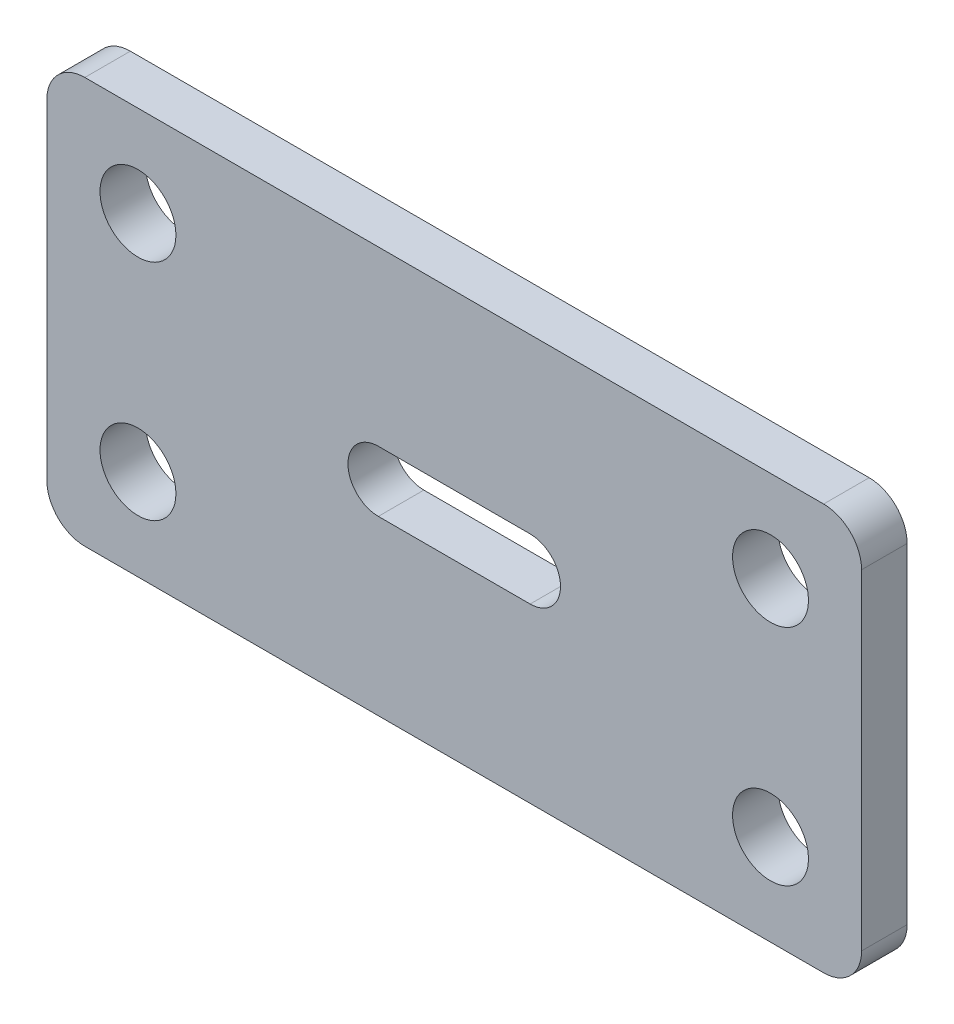
ISO-10303-21;
HEADER;
FILE_DESCRIPTION(('STEP AP214'),'2;1');
FILE_NAME('part.step','',(''),(''),'','','');
FILE_SCHEMA(('AUTOMOTIVE_DESIGN { 1 0 10303 214 1 1 1 1 }'));
ENDSEC;
DATA;
#1=APPLICATION_CONTEXT('core data for automotive mechanical design processes');
#2=APPLICATION_PROTOCOL_DEFINITION('international standard','automotive_design',2000,#1);
#3=PRODUCT_CONTEXT('',#1,'mechanical');
#4=PRODUCT('Part','Part','',(#3));
#5=PRODUCT_RELATED_PRODUCT_CATEGORY('part','',(#4));
#6=PRODUCT_DEFINITION_FORMATION('','',#4);
#7=PRODUCT_DEFINITION_CONTEXT('part definition',#1,'design');
#8=PRODUCT_DEFINITION('design','',#6,#7);
#9=PRODUCT_DEFINITION_SHAPE('','',#8);
#10=(LENGTH_UNIT() NAMED_UNIT(*) SI_UNIT(.MILLI.,.METRE.));
#11=(NAMED_UNIT(*) PLANE_ANGLE_UNIT() SI_UNIT($,.RADIAN.));
#12=(NAMED_UNIT(*) SI_UNIT($,.STERADIAN.) SOLID_ANGLE_UNIT());
#13=UNCERTAINTY_MEASURE_WITH_UNIT(LENGTH_MEASURE(1.E-05),#10,'distance_accuracy_value','');
#14=(GEOMETRIC_REPRESENTATION_CONTEXT(3) GLOBAL_UNCERTAINTY_ASSIGNED_CONTEXT((#13)) GLOBAL_UNIT_ASSIGNED_CONTEXT((#10,
#11,#12)) REPRESENTATION_CONTEXT('',''));
#15=CARTESIAN_POINT('',(0.,0.,0.));
#16=DIRECTION('',(0.,0.,1.));
#17=DIRECTION('',(1.,0.,0.));
#18=AXIS2_PLACEMENT_3D('',#15,#16,#17);
#19=CARTESIAN_POINT('',(48.6689135783933,-141.130234818841,-582.548439615241));
#20=DIRECTION('',(0.,0.,1.));
#21=DIRECTION('',(1.,0.,0.));
#22=AXIS2_PLACEMENT_3D('',#19,#20,#21);
#23=PLANE('',#22);
#24=DIRECTION('',(1.,0.,0.));
#25=VECTOR('',#24,1.);
#26=CARTESIAN_POINT('',(0.,-115.384107551489,-582.548439615241));
#27=LINE('',#26,#25);
#28=CARTESIAN_POINT('',(-10.,-115.384107551489,-582.548439615241));
#29=VERTEX_POINT('',#28);
#30=CARTESIAN_POINT('',(10.,-115.384107551489,-582.548439615241));
#31=VERTEX_POINT('',#30);
#32=EDGE_CURVE('E160',#29,#31,#27,.T.);
#33=ORIENTED_EDGE('',*,*,#32,.F.);
#34=CARTESIAN_POINT('',(-10.,-119.384107551489,-582.548439615241));
#35=DIRECTION('',(0.,0.,1.));
#36=DIRECTION('',(1.,0.,0.));
#37=AXIS2_PLACEMENT_3D('',#34,#35,#36);
#38=CIRCLE('',#37,4.);
#39=CARTESIAN_POINT('',(-10.,-123.384107551489,-582.548439615241));
#40=VERTEX_POINT('',#39);
#41=EDGE_CURVE('E153',#29,#40,#38,.T.);
#42=ORIENTED_EDGE('',*,*,#41,.T.);
#43=DIRECTION('',(1.,0.,0.));
#44=VECTOR('',#43,1.);
#45=CARTESIAN_POINT('',(0.,-123.384107551489,-582.548439615241));
#46=LINE('',#45,#44);
#47=CARTESIAN_POINT('',(10.,-123.384107551489,-582.548439615241));
#48=VERTEX_POINT('',#47);
#49=EDGE_CURVE('E136',#40,#48,#46,.T.);
#50=ORIENTED_EDGE('',*,*,#49,.T.);
#51=CARTESIAN_POINT('',(10.,-119.384107551489,-582.548439615241));
#52=DIRECTION('',(0.,0.,-1.));
#53=DIRECTION('',(-1.,0.,0.));
#54=AXIS2_PLACEMENT_3D('',#51,#52,#53);
#55=CIRCLE('',#54,4.);
#56=EDGE_CURVE('E231',#31,#48,#55,.T.);
#57=ORIENTED_EDGE('',*,*,#56,.F.);
#58=EDGE_LOOP('',(#33,#42,#50,#57));
#59=FACE_BOUND('',#58,.T.);
#60=CARTESIAN_POINT('',(41.6689135783934,-134.130234818843,-582.548439615241));
#61=DIRECTION('',(0.,0.,-1.));
#62=DIRECTION('',(-1.,0.,0.));
#63=AXIS2_PLACEMENT_3D('',#60,#61,#62);
#64=CIRCLE('',#63,5.00000000000078);
#65=CARTESIAN_POINT('',(36.6689135783926,-134.130234818843,-582.548439615241));
#66=VERTEX_POINT('',#65);
#67=EDGE_CURVE('E235',#66,#66,#64,.T.);
#68=ORIENTED_EDGE('',*,*,#67,.F.);
#69=EDGE_LOOP('',(#68));
#70=FACE_BOUND('',#69,.T.);
#71=CARTESIAN_POINT('',(41.6689135783934,-104.637980284137,-582.548439615241));
#72=DIRECTION('',(0.,0.,-1.));
#73=DIRECTION('',(-1.,0.,0.));
#74=AXIS2_PLACEMENT_3D('',#71,#72,#73);
#75=CIRCLE('',#74,5.);
#76=CARTESIAN_POINT('',(36.6689135783934,-104.637980284137,-582.548439615241));
#77=VERTEX_POINT('',#76);
#78=EDGE_CURVE('E243',#77,#77,#75,.T.);
#79=ORIENTED_EDGE('',*,*,#78,.F.);
#80=EDGE_LOOP('',(#79));
#81=FACE_BOUND('',#80,.T.);
#82=CARTESIAN_POINT('',(-48.6689135783934,-97.6379802841375,-582.548439615241));
#83=DIRECTION('',(0.,0.,1.));
#84=DIRECTION('',(1.,0.,0.));
#85=AXIS2_PLACEMENT_3D('',#82,#83,#84);
#86=CIRCLE('',#85,5.);
#87=CARTESIAN_POINT('',(-48.6689135783933,-92.6379802841375,-582.548439615241));
#88=VERTEX_POINT('',#87);
#89=CARTESIAN_POINT('',(-53.6689135783934,-97.6379802841375,-582.548439615241));
#90=VERTEX_POINT('',#89);
#91=EDGE_CURVE('E190',#88,#90,#86,.T.);
#92=ORIENTED_EDGE('',*,*,#91,.F.);
#93=DIRECTION('',(1.,0.,0.));
#94=VECTOR('',#93,1.);
#95=CARTESIAN_POINT('',(48.6689135783933,-92.6379802841375,-582.548439615241));
#96=LINE('',#95,#94);
#97=CARTESIAN_POINT('',(48.6689135783933,-92.6379802841375,-582.548439615241));
#98=VERTEX_POINT('',#97);
#99=EDGE_CURVE('E255',#88,#98,#96,.T.);
#100=ORIENTED_EDGE('',*,*,#99,.T.);
#101=CARTESIAN_POINT('',(48.6689135783934,-97.6379802841375,-582.548439615241));
#102=DIRECTION('',(0.,0.,-1.));
#103=DIRECTION('',(-1.,0.,0.));
#104=AXIS2_PLACEMENT_3D('',#101,#102,#103);
#105=CIRCLE('',#104,5.);
#106=CARTESIAN_POINT('',(53.6689135783934,-97.6379802841375,-582.548439615241));
#107=VERTEX_POINT('',#106);
#108=EDGE_CURVE('E258',#98,#107,#105,.T.);
#109=ORIENTED_EDGE('',*,*,#108,.T.);
#110=DIRECTION('',(0.,-1.,0.));
#111=VECTOR('',#110,1.);
#112=CARTESIAN_POINT('',(53.6689135783934,-97.6379802841375,-582.548439615241));
#113=LINE('',#112,#111);
#114=CARTESIAN_POINT('',(53.6689135783933,-141.130234818841,-582.548439615241));
#115=VERTEX_POINT('',#114);
#116=EDGE_CURVE('E60',#107,#115,#113,.T.);
#117=ORIENTED_EDGE('',*,*,#116,.T.);
#118=CARTESIAN_POINT('',(48.6689135783933,-141.130234818841,-582.548439615241));
#119=DIRECTION('',(0.,0.,-1.));
#120=DIRECTION('',(1.,0.,0.));
#121=AXIS2_PLACEMENT_3D('',#118,#119,#120);
#122=CIRCLE('',#121,5.);
#123=CARTESIAN_POINT('',(48.6689135783933,-146.130234818841,-582.548439615241));
#124=VERTEX_POINT('',#123);
#125=EDGE_CURVE('E250',#115,#124,#122,.T.);
#126=ORIENTED_EDGE('',*,*,#125,.T.);
#127=DIRECTION('',(-1.,0.,0.));
#128=VECTOR('',#127,1.);
#129=CARTESIAN_POINT('',(48.6689135783933,-146.130234818841,-582.548439615241));
#130=LINE('',#129,#128);
#131=CARTESIAN_POINT('',(-48.6689135783933,-146.130234818841,-582.548439615241));
#132=VERTEX_POINT('',#131);
#133=EDGE_CURVE('E89',#124,#132,#130,.T.);
#134=ORIENTED_EDGE('',*,*,#133,.T.);
#135=CARTESIAN_POINT('',(-48.6689135783933,-141.130234818841,-582.548439615241));
#136=DIRECTION('',(0.,0.,1.));
#137=DIRECTION('',(-1.,0.,0.));
#138=AXIS2_PLACEMENT_3D('',#135,#136,#137);
#139=CIRCLE('',#138,5.);
#140=CARTESIAN_POINT('',(-53.6689135783933,-141.130234818841,-582.548439615241));
#141=VERTEX_POINT('',#140);
#142=EDGE_CURVE('E186',#141,#132,#139,.T.);
#143=ORIENTED_EDGE('',*,*,#142,.F.);
#144=DIRECTION('',(0.,-1.,0.));
#145=VECTOR('',#144,1.);
#146=CARTESIAN_POINT('',(-53.6689135783934,-97.6379802841375,-582.548439615241));
#147=LINE('',#146,#145);
#148=EDGE_CURVE('E195',#90,#141,#147,.T.);
#149=ORIENTED_EDGE('',*,*,#148,.F.);
#150=EDGE_LOOP('',(#92,#100,#109,#117,#126,#134,#143,#149));
#151=FACE_BOUND('',#150,.T.);
#152=CARTESIAN_POINT('',(-41.6689135783934,-134.130234818843,-582.548439615241));
#153=DIRECTION('',(0.,0.,1.));
#154=DIRECTION('',(1.,0.,0.));
#155=AXIS2_PLACEMENT_3D('',#152,#153,#154);
#156=CIRCLE('',#155,5.00000000000078);
#157=CARTESIAN_POINT('',(-36.6689135783926,-134.130234818843,-582.548439615241));
#158=VERTEX_POINT('',#157);
#159=EDGE_CURVE('E170',#158,#158,#156,.T.);
#160=ORIENTED_EDGE('',*,*,#159,.T.);
#161=EDGE_LOOP('',(#160));
#162=FACE_BOUND('',#161,.T.);
#163=CARTESIAN_POINT('',(-41.6689135783934,-104.637980284137,-582.548439615241));
#164=DIRECTION('',(0.,0.,1.));
#165=DIRECTION('',(1.,0.,0.));
#166=AXIS2_PLACEMENT_3D('',#163,#164,#165);
#167=CIRCLE('',#166,5.);
#168=CARTESIAN_POINT('',(-36.6689135783934,-104.637980284137,-582.548439615241));
#169=VERTEX_POINT('',#168);
#170=EDGE_CURVE('E178',#169,#169,#167,.T.);
#171=ORIENTED_EDGE('',*,*,#170,.T.);
#172=EDGE_LOOP('',(#171));
#173=FACE_BOUND('',#172,.T.);
#174=ADVANCED_FACE('F36',(#59,#70,#81,#151,#162,#173),#23,.F.);
#175=CARTESIAN_POINT('',(48.6689135783933,-141.130234818841,-576.548439615241));
#176=DIRECTION('',(0.,0.,1.));
#177=DIRECTION('',(1.,0.,0.));
#178=AXIS2_PLACEMENT_3D('',#175,#176,#177);
#179=PLANE('',#178);
#180=DIRECTION('',(1.,0.,0.));
#181=VECTOR('',#180,1.);
#182=CARTESIAN_POINT('',(48.6689135783933,-92.6379802841375,-576.548439615241));
#183=LINE('',#182,#181);
#184=CARTESIAN_POINT('',(-48.6689135783933,-92.6379802841375,-576.548439615241));
#185=VERTEX_POINT('',#184);
#186=CARTESIAN_POINT('',(48.6689135783933,-92.6379802841375,-576.548439615241));
#187=VERTEX_POINT('',#186);
#188=EDGE_CURVE('E270',#185,#187,#183,.T.);
#189=ORIENTED_EDGE('',*,*,#188,.F.);
#190=CARTESIAN_POINT('',(-48.6689135783934,-97.6379802841375,-576.548439615241));
#191=DIRECTION('',(0.,0.,1.));
#192=DIRECTION('',(1.,0.,0.));
#193=AXIS2_PLACEMENT_3D('',#190,#191,#192);
#194=CIRCLE('',#193,5.);
#195=CARTESIAN_POINT('',(-53.6689135783934,-97.6379802841375,-576.548439615241));
#196=VERTEX_POINT('',#195);
#197=EDGE_CURVE('E203',#185,#196,#194,.T.);
#198=ORIENTED_EDGE('',*,*,#197,.T.);
#199=DIRECTION('',(0.,-1.,0.));
#200=VECTOR('',#199,1.);
#201=CARTESIAN_POINT('',(-53.6689135783934,-97.6379802841375,-576.548439615241));
#202=LINE('',#201,#200);
#203=CARTESIAN_POINT('',(-53.6689135783933,-141.130234818841,-576.548439615241));
#204=VERTEX_POINT('',#203);
#205=EDGE_CURVE('E191',#196,#204,#202,.T.);
#206=ORIENTED_EDGE('',*,*,#205,.T.);
#207=CARTESIAN_POINT('',(-48.6689135783933,-141.130234818841,-576.548439615241));
#208=DIRECTION('',(0.,0.,1.));
#209=DIRECTION('',(-1.,0.,0.));
#210=AXIS2_PLACEMENT_3D('',#207,#208,#209);
#211=CIRCLE('',#210,5.);
#212=CARTESIAN_POINT('',(-48.6689135783933,-146.130234818841,-576.548439615241));
#213=VERTEX_POINT('',#212);
#214=EDGE_CURVE('E182',#204,#213,#211,.T.);
#215=ORIENTED_EDGE('',*,*,#214,.T.);
#216=DIRECTION('',(-1.,0.,0.));
#217=VECTOR('',#216,1.);
#218=CARTESIAN_POINT('',(48.6689135783933,-146.130234818841,-576.548439615241));
#219=LINE('',#218,#217);
#220=CARTESIAN_POINT('',(48.6689135783933,-146.130234818841,-576.548439615241));
#221=VERTEX_POINT('',#220);
#222=EDGE_CURVE('E267',#221,#213,#219,.T.);
#223=ORIENTED_EDGE('',*,*,#222,.F.);
#224=CARTESIAN_POINT('',(48.6689135783933,-141.130234818841,-576.548439615241));
#225=DIRECTION('',(0.,0.,-1.));
#226=DIRECTION('',(1.,0.,0.));
#227=AXIS2_PLACEMENT_3D('',#224,#225,#226);
#228=CIRCLE('',#227,5.);
#229=CARTESIAN_POINT('',(53.6689135783933,-141.130234818841,-576.548439615241));
#230=VERTEX_POINT('',#229);
#231=EDGE_CURVE('E247',#230,#221,#228,.T.);
#232=ORIENTED_EDGE('',*,*,#231,.F.);
#233=DIRECTION('',(0.,-1.,0.));
#234=VECTOR('',#233,1.);
#235=CARTESIAN_POINT('',(53.6689135783934,-97.6379802841375,-576.548439615241));
#236=LINE('',#235,#234);
#237=CARTESIAN_POINT('',(53.6689135783934,-97.6379802841375,-576.548439615241));
#238=VERTEX_POINT('',#237);
#239=EDGE_CURVE('E81',#238,#230,#236,.T.);
#240=ORIENTED_EDGE('',*,*,#239,.F.);
#241=CARTESIAN_POINT('',(48.6689135783934,-97.6379802841375,-576.548439615241));
#242=DIRECTION('',(0.,0.,-1.));
#243=DIRECTION('',(-1.,0.,0.));
#244=AXIS2_PLACEMENT_3D('',#241,#242,#243);
#245=CIRCLE('',#244,5.);
#246=EDGE_CURVE('E273',#187,#238,#245,.T.);
#247=ORIENTED_EDGE('',*,*,#246,.F.);
#248=EDGE_LOOP('',(#189,#198,#206,#215,#223,#232,#240,#247));
#249=FACE_BOUND('',#248,.T.);
#250=CARTESIAN_POINT('',(41.6689135783934,-134.130234818843,-576.548439615241));
#251=DIRECTION('',(0.,0.,-1.));
#252=DIRECTION('',(-1.,0.,0.));
#253=AXIS2_PLACEMENT_3D('',#250,#251,#252);
#254=CIRCLE('',#253,5.00000000000078);
#255=CARTESIAN_POINT('',(36.6689135783926,-134.130234818843,-576.548439615241));
#256=VERTEX_POINT('',#255);
#257=EDGE_CURVE('E239',#256,#256,#254,.T.);
#258=ORIENTED_EDGE('',*,*,#257,.T.);
#259=EDGE_LOOP('',(#258));
#260=FACE_BOUND('',#259,.T.);
#261=CARTESIAN_POINT('',(41.6689135783934,-104.637980284137,-576.548439615241));
#262=DIRECTION('',(0.,0.,-1.));
#263=DIRECTION('',(-1.,0.,0.));
#264=AXIS2_PLACEMENT_3D('',#261,#262,#263);
#265=CIRCLE('',#264,5.);
#266=CARTESIAN_POINT('',(36.6689135783934,-104.637980284137,-576.548439615241));
#267=VERTEX_POINT('',#266);
#268=EDGE_CURVE('E238',#267,#267,#265,.T.);
#269=ORIENTED_EDGE('',*,*,#268,.T.);
#270=EDGE_LOOP('',(#269));
#271=FACE_BOUND('',#270,.T.);
#272=CARTESIAN_POINT('',(-10.,-119.384107551489,-576.548439615241));
#273=DIRECTION('',(0.,0.,-1.));
#274=DIRECTION('',(-1.,0.,0.));
#275=AXIS2_PLACEMENT_3D('',#272,#273,#274);
#276=CIRCLE('',#275,4.);
#277=CARTESIAN_POINT('',(-10.,-123.384107551489,-576.548439615241));
#278=VERTEX_POINT('',#277);
#279=CARTESIAN_POINT('',(-10.,-115.384107551489,-576.548439615241));
#280=VERTEX_POINT('',#279);
#281=EDGE_CURVE('E155',#278,#280,#276,.T.);
#282=ORIENTED_EDGE('',*,*,#281,.T.);
#283=DIRECTION('',(1.,0.,0.));
#284=VECTOR('',#283,1.);
#285=CARTESIAN_POINT('',(0.,-115.384107551489,-576.548439615241));
#286=LINE('',#285,#284);
#287=CARTESIAN_POINT('',(10.,-115.384107551489,-576.548439615241));
#288=VERTEX_POINT('',#287);
#289=EDGE_CURVE('E226',#280,#288,#286,.T.);
#290=ORIENTED_EDGE('',*,*,#289,.T.);
#291=CARTESIAN_POINT('',(10.,-119.384107551489,-576.548439615241));
#292=DIRECTION('',(0.,0.,1.));
#293=DIRECTION('',(1.,0.,0.));
#294=AXIS2_PLACEMENT_3D('',#291,#292,#293);
#295=CIRCLE('',#294,4.);
#296=CARTESIAN_POINT('',(10.,-123.384107551489,-576.548439615241));
#297=VERTEX_POINT('',#296);
#298=EDGE_CURVE('E234',#297,#288,#295,.T.);
#299=ORIENTED_EDGE('',*,*,#298,.F.);
#300=DIRECTION('',(1.,0.,0.));
#301=VECTOR('',#300,1.);
#302=CARTESIAN_POINT('',(0.,-123.384107551489,-576.548439615241));
#303=LINE('',#302,#301);
#304=EDGE_CURVE('E146',#278,#297,#303,.T.);
#305=ORIENTED_EDGE('',*,*,#304,.F.);
#306=EDGE_LOOP('',(#282,#290,#299,#305));
#307=FACE_BOUND('',#306,.T.);
#308=CARTESIAN_POINT('',(-41.6689135783934,-134.130234818843,-576.548439615241));
#309=DIRECTION('',(0.,0.,1.));
#310=DIRECTION('',(1.,0.,0.));
#311=AXIS2_PLACEMENT_3D('',#308,#309,#310);
#312=CIRCLE('',#311,5.00000000000078);
#313=CARTESIAN_POINT('',(-36.6689135783926,-134.130234818843,-576.548439615241));
#314=VERTEX_POINT('',#313);
#315=EDGE_CURVE('E167',#314,#314,#312,.T.);
#316=ORIENTED_EDGE('',*,*,#315,.F.);
#317=EDGE_LOOP('',(#316));
#318=FACE_BOUND('',#317,.T.);
#319=CARTESIAN_POINT('',(-41.6689135783934,-104.637980284137,-576.548439615241));
#320=DIRECTION('',(0.,0.,1.));
#321=DIRECTION('',(1.,0.,0.));
#322=AXIS2_PLACEMENT_3D('',#319,#320,#321);
#323=CIRCLE('',#322,5.);
#324=CARTESIAN_POINT('',(-36.6689135783934,-104.637980284137,-576.548439615241));
#325=VERTEX_POINT('',#324);
#326=EDGE_CURVE('E174',#325,#325,#323,.T.);
#327=ORIENTED_EDGE('',*,*,#326,.F.);
#328=EDGE_LOOP('',(#327));
#329=FACE_BOUND('',#328,.T.);
#330=ADVANCED_FACE('F295',(#249,#260,#271,#307,#318,#329),#179,.T.);
#331=CARTESIAN_POINT('',(48.6689135783933,-146.130234818841,-582.548439615241));
#332=DIRECTION('',(0.,1.,0.));
#333=DIRECTION('',(0.,0.,1.));
#334=AXIS2_PLACEMENT_3D('',#331,#332,#333);
#335=PLANE('',#334);
#336=ORIENTED_EDGE('',*,*,#222,.T.);
#337=DIRECTION('',(0.,0.,1.));
#338=VECTOR('',#337,1.);
#339=CARTESIAN_POINT('',(-48.6689135783933,-146.130234818841,-582.548439615241));
#340=LINE('',#339,#338);
#341=EDGE_CURVE('E157',#132,#213,#340,.T.);
#342=ORIENTED_EDGE('',*,*,#341,.F.);
#343=ORIENTED_EDGE('',*,*,#133,.F.);
#344=DIRECTION('',(0.,0.,1.));
#345=VECTOR('',#344,1.);
#346=CARTESIAN_POINT('',(48.6689135783933,-146.130234818841,-582.548439615241));
#347=LINE('',#346,#345);
#348=EDGE_CURVE('E287',#124,#221,#347,.T.);
#349=ORIENTED_EDGE('',*,*,#348,.T.);
#350=EDGE_LOOP('',(#336,#342,#343,#349));
#351=FACE_BOUND('',#350,.T.);
#352=ADVANCED_FACE('F314',(#351),#335,.F.);
#353=CARTESIAN_POINT('',(48.6689135783933,-92.6379802841375,-582.548439615241));
#354=DIRECTION('',(0.,-1.,0.));
#355=DIRECTION('',(0.,0.,-1.));
#356=AXIS2_PLACEMENT_3D('',#353,#354,#355);
#357=PLANE('',#356);
#358=ORIENTED_EDGE('',*,*,#99,.F.);
#359=DIRECTION('',(0.,0.,1.));
#360=VECTOR('',#359,1.);
#361=CARTESIAN_POINT('',(-48.6689135783933,-92.6379802841375,-582.548439615241));
#362=LINE('',#361,#360);
#363=EDGE_CURVE('E215',#88,#185,#362,.T.);
#364=ORIENTED_EDGE('',*,*,#363,.T.);
#365=ORIENTED_EDGE('',*,*,#188,.T.);
#366=DIRECTION('',(0.,0.,1.));
#367=VECTOR('',#366,1.);
#368=CARTESIAN_POINT('',(48.6689135783933,-92.6379802841375,-582.548439615241));
#369=LINE('',#368,#367);
#370=EDGE_CURVE('E283',#98,#187,#369,.T.);
#371=ORIENTED_EDGE('',*,*,#370,.F.);
#372=EDGE_LOOP('',(#358,#364,#365,#371));
#373=FACE_BOUND('',#372,.T.);
#374=ADVANCED_FACE('F326',(#373),#357,.F.);
#375=CARTESIAN_POINT('',(10.,-119.384107551489,-558.548439615241));
#376=DIRECTION('',(0.,0.,-1.));
#377=DIRECTION('',(-1.,0.,0.));
#378=AXIS2_PLACEMENT_3D('',#375,#376,#377);
#379=CYLINDRICAL_SURFACE('',#378,4.);
#380=DIRECTION('',(0.,0.,-1.));
#381=VECTOR('',#380,1.);
#382=CARTESIAN_POINT('',(10.,-115.384107551489,-558.548439615241));
#383=LINE('',#382,#381);
#384=EDGE_CURVE('E11',#31,#288,#383,.F.);
#385=ORIENTED_EDGE('',*,*,#384,.F.);
#386=ORIENTED_EDGE('',*,*,#56,.T.);
#387=DIRECTION('',(0.,0.,-1.));
#388=VECTOR('',#387,1.);
#389=CARTESIAN_POINT('',(10.,-123.384107551489,-558.548439615241));
#390=LINE('',#389,#388);
#391=EDGE_CURVE('E45',#297,#48,#390,.T.);
#392=ORIENTED_EDGE('',*,*,#391,.F.);
#393=ORIENTED_EDGE('',*,*,#298,.T.);
#394=EDGE_LOOP('',(#385,#386,#392,#393));
#395=FACE_BOUND('',#394,.T.);
#396=ADVANCED_FACE('F293',(#395),#379,.F.);
#397=CARTESIAN_POINT('',(48.6689135783933,-141.130234818841,-582.548439615241));
#398=DIRECTION('',(0.,0.,1.));
#399=DIRECTION('',(1.,0.,0.));
#400=AXIS2_PLACEMENT_3D('',#397,#398,#399);
#401=CYLINDRICAL_SURFACE('',#400,5.);
#402=ORIENTED_EDGE('',*,*,#231,.T.);
#403=ORIENTED_EDGE('',*,*,#348,.F.);
#404=ORIENTED_EDGE('',*,*,#125,.F.);
#405=DIRECTION('',(0.,0.,1.));
#406=VECTOR('',#405,1.);
#407=CARTESIAN_POINT('',(53.6689135783933,-141.130234818841,-582.548439615241));
#408=LINE('',#407,#406);
#409=EDGE_CURVE('E263',#115,#230,#408,.T.);
#410=ORIENTED_EDGE('',*,*,#409,.T.);
#411=EDGE_LOOP('',(#402,#403,#404,#410));
#412=FACE_BOUND('',#411,.T.);
#413=ADVANCED_FACE('F38',(#412),#401,.T.);
#414=CARTESIAN_POINT('',(48.6689135783934,-97.6379802841375,-582.548439615241));
#415=DIRECTION('',(0.,0.,1.));
#416=DIRECTION('',(1.,0.,0.));
#417=AXIS2_PLACEMENT_3D('',#414,#415,#416);
#418=CYLINDRICAL_SURFACE('',#417,5.);
#419=ORIENTED_EDGE('',*,*,#246,.T.);
#420=DIRECTION('',(0.,0.,1.));
#421=VECTOR('',#420,1.);
#422=CARTESIAN_POINT('',(53.6689135783934,-97.6379802841375,-582.548439615241));
#423=LINE('',#422,#421);
#424=EDGE_CURVE('E280',#107,#238,#423,.T.);
#425=ORIENTED_EDGE('',*,*,#424,.F.);
#426=ORIENTED_EDGE('',*,*,#108,.F.);
#427=ORIENTED_EDGE('',*,*,#370,.T.);
#428=EDGE_LOOP('',(#419,#425,#426,#427));
#429=FACE_BOUND('',#428,.T.);
#430=ADVANCED_FACE('F322',(#429),#418,.T.);
#431=CARTESIAN_POINT('',(53.6689135783934,-97.6379802841375,-582.548439615241));
#432=DIRECTION('',(-1.,0.,0.));
#433=DIRECTION('',(0.,-1.,0.));
#434=AXIS2_PLACEMENT_3D('',#431,#432,#433);
#435=PLANE('',#434);
#436=ORIENTED_EDGE('',*,*,#239,.T.);
#437=ORIENTED_EDGE('',*,*,#409,.F.);
#438=ORIENTED_EDGE('',*,*,#116,.F.);
#439=ORIENTED_EDGE('',*,*,#424,.T.);
#440=EDGE_LOOP('',(#436,#437,#438,#439));
#441=FACE_BOUND('',#440,.T.);
#442=ADVANCED_FACE('F319',(#441),#435,.F.);
#443=CARTESIAN_POINT('',(41.6689135783934,-104.637980284137,-582.548439615241));
#444=DIRECTION('',(0.,0.,1.));
#445=DIRECTION('',(1.,0.,0.));
#446=AXIS2_PLACEMENT_3D('',#443,#444,#445);
#447=CYLINDRICAL_SURFACE('',#446,5.);
#448=ORIENTED_EDGE('',*,*,#78,.T.);
#449=EDGE_LOOP('',(#448));
#450=FACE_BOUND('',#449,.T.);
#451=ORIENTED_EDGE('',*,*,#268,.F.);
#452=EDGE_LOOP('',(#451));
#453=FACE_BOUND('',#452,.T.);
#454=ADVANCED_FACE('F306',(#450,#453),#447,.F.);
#455=CARTESIAN_POINT('',(41.6689135783934,-134.130234818843,-582.548439615241));
#456=DIRECTION('',(0.,0.,1.));
#457=DIRECTION('',(1.,0.,0.));
#458=AXIS2_PLACEMENT_3D('',#455,#456,#457);
#459=CYLINDRICAL_SURFACE('',#458,5.00000000000078);
#460=ORIENTED_EDGE('',*,*,#67,.T.);
#461=EDGE_LOOP('',(#460));
#462=FACE_BOUND('',#461,.T.);
#463=ORIENTED_EDGE('',*,*,#257,.F.);
#464=EDGE_LOOP('',(#463));
#465=FACE_BOUND('',#464,.T.);
#466=ADVANCED_FACE('F300',(#462,#465),#459,.F.);
#467=CARTESIAN_POINT('',(0.,-115.384107551489,-582.548439615241));
#468=DIRECTION('',(0.,1.,0.));
#469=DIRECTION('',(-1.,0.,0.));
#470=AXIS2_PLACEMENT_3D('',#467,#468,#469);
#471=PLANE('',#470);
#472=ORIENTED_EDGE('',*,*,#384,.T.);
#473=ORIENTED_EDGE('',*,*,#289,.F.);
#474=DIRECTION('',(0.,0.,-1.));
#475=VECTOR('',#474,1.);
#476=CARTESIAN_POINT('',(-10.,-115.384107551489,-558.548439615241));
#477=LINE('',#476,#475);
#478=EDGE_CURVE('E147',#29,#280,#477,.F.);
#479=ORIENTED_EDGE('',*,*,#478,.F.);
#480=ORIENTED_EDGE('',*,*,#32,.T.);
#481=EDGE_LOOP('',(#472,#473,#479,#480));
#482=FACE_BOUND('',#481,.T.);
#483=ADVANCED_FACE('F298',(#482),#471,.F.);
#484=CARTESIAN_POINT('',(0.,-123.384107551489,-576.548439615241));
#485=DIRECTION('',(0.,-1.,0.));
#486=DIRECTION('',(1.,0.,0.));
#487=AXIS2_PLACEMENT_3D('',#484,#485,#486);
#488=PLANE('',#487);
#489=ORIENTED_EDGE('',*,*,#391,.T.);
#490=ORIENTED_EDGE('',*,*,#49,.F.);
#491=DIRECTION('',(0.,0.,-1.));
#492=VECTOR('',#491,1.);
#493=CARTESIAN_POINT('',(-10.,-123.384107551489,-558.548439615241));
#494=LINE('',#493,#492);
#495=EDGE_CURVE('E140',#278,#40,#494,.T.);
#496=ORIENTED_EDGE('',*,*,#495,.F.);
#497=ORIENTED_EDGE('',*,*,#304,.T.);
#498=EDGE_LOOP('',(#489,#490,#496,#497));
#499=FACE_BOUND('',#498,.T.);
#500=ADVANCED_FACE('F138',(#499),#488,.F.);
#501=CARTESIAN_POINT('',(-10.,-119.384107551489,-558.548439615241));
#502=DIRECTION('',(0.,0.,-1.));
#503=DIRECTION('',(1.,0.,0.));
#504=AXIS2_PLACEMENT_3D('',#501,#502,#503);
#505=CYLINDRICAL_SURFACE('',#504,4.);
#506=ORIENTED_EDGE('',*,*,#478,.T.);
#507=ORIENTED_EDGE('',*,*,#281,.F.);
#508=ORIENTED_EDGE('',*,*,#495,.T.);
#509=ORIENTED_EDGE('',*,*,#41,.F.);
#510=EDGE_LOOP('',(#506,#507,#508,#509));
#511=FACE_BOUND('',#510,.T.);
#512=ADVANCED_FACE('F152',(#511),#505,.F.);
#513=CARTESIAN_POINT('',(-48.6689135783933,-141.130234818841,-582.548439615241));
#514=DIRECTION('',(0.,0.,1.));
#515=DIRECTION('',(-1.,0.,0.));
#516=AXIS2_PLACEMENT_3D('',#513,#514,#515);
#517=CYLINDRICAL_SURFACE('',#516,5.);
#518=ORIENTED_EDGE('',*,*,#214,.F.);
#519=DIRECTION('',(0.,0.,1.));
#520=VECTOR('',#519,1.);
#521=CARTESIAN_POINT('',(-53.6689135783933,-141.130234818841,-582.548439615241));
#522=LINE('',#521,#520);
#523=EDGE_CURVE('E199',#141,#204,#522,.T.);
#524=ORIENTED_EDGE('',*,*,#523,.F.);
#525=ORIENTED_EDGE('',*,*,#142,.T.);
#526=ORIENTED_EDGE('',*,*,#341,.T.);
#527=EDGE_LOOP('',(#518,#524,#525,#526));
#528=FACE_BOUND('',#527,.T.);
#529=ADVANCED_FACE('F335',(#528),#517,.T.);
#530=CARTESIAN_POINT('',(-48.6689135783934,-97.6379802841375,-582.548439615241));
#531=DIRECTION('',(0.,0.,1.));
#532=DIRECTION('',(-1.,0.,0.));
#533=AXIS2_PLACEMENT_3D('',#530,#531,#532);
#534=CYLINDRICAL_SURFACE('',#533,5.);
#535=ORIENTED_EDGE('',*,*,#197,.F.);
#536=ORIENTED_EDGE('',*,*,#363,.F.);
#537=ORIENTED_EDGE('',*,*,#91,.T.);
#538=DIRECTION('',(0.,0.,1.));
#539=VECTOR('',#538,1.);
#540=CARTESIAN_POINT('',(-53.6689135783934,-97.6379802841375,-582.548439615241));
#541=LINE('',#540,#539);
#542=EDGE_CURVE('E212',#90,#196,#541,.T.);
#543=ORIENTED_EDGE('',*,*,#542,.T.);
#544=EDGE_LOOP('',(#535,#536,#537,#543));
#545=FACE_BOUND('',#544,.T.);
#546=ADVANCED_FACE('F353',(#545),#534,.T.);
#547=CARTESIAN_POINT('',(-53.6689135783934,-97.6379802841375,-582.548439615241));
#548=DIRECTION('',(1.,0.,0.));
#549=DIRECTION('',(0.,-1.,0.));
#550=AXIS2_PLACEMENT_3D('',#547,#548,#549);
#551=PLANE('',#550);
#552=ORIENTED_EDGE('',*,*,#205,.F.);
#553=ORIENTED_EDGE('',*,*,#542,.F.);
#554=ORIENTED_EDGE('',*,*,#148,.T.);
#555=ORIENTED_EDGE('',*,*,#523,.T.);
#556=EDGE_LOOP('',(#552,#553,#554,#555));
#557=FACE_BOUND('',#556,.T.);
#558=ADVANCED_FACE('F341',(#557),#551,.F.);
#559=CARTESIAN_POINT('',(-41.6689135783934,-104.637980284137,-582.548439615241));
#560=DIRECTION('',(0.,0.,1.));
#561=DIRECTION('',(-1.,0.,0.));
#562=AXIS2_PLACEMENT_3D('',#559,#560,#561);
#563=CYLINDRICAL_SURFACE('',#562,5.);
#564=ORIENTED_EDGE('',*,*,#170,.F.);
#565=EDGE_LOOP('',(#564));
#566=FACE_BOUND('',#565,.T.);
#567=ORIENTED_EDGE('',*,*,#326,.T.);
#568=EDGE_LOOP('',(#567));
#569=FACE_BOUND('',#568,.T.);
#570=ADVANCED_FACE('F359',(#566,#569),#563,.F.);
#571=CARTESIAN_POINT('',(-41.6689135783934,-134.130234818843,-582.548439615241));
#572=DIRECTION('',(0.,0.,1.));
#573=DIRECTION('',(-1.,0.,0.));
#574=AXIS2_PLACEMENT_3D('',#571,#572,#573);
#575=CYLINDRICAL_SURFACE('',#574,5.00000000000078);
#576=ORIENTED_EDGE('',*,*,#159,.F.);
#577=EDGE_LOOP('',(#576));
#578=FACE_BOUND('',#577,.T.);
#579=ORIENTED_EDGE('',*,*,#315,.T.);
#580=EDGE_LOOP('',(#579));
#581=FACE_BOUND('',#580,.T.);
#582=ADVANCED_FACE('F365',(#578,#581),#575,.F.);
#583=CLOSED_SHELL('',(#174,#330,#352,#374,#396,#413,#430,#442,#454,#466,#483,#500,#512,#529,
#546,#558,#570,#582));
#584=MANIFOLD_SOLID_BREP('B2',#583);
#585=ADVANCED_BREP_SHAPE_REPRESENTATION('',(#18,#584),#14);
#586=SHAPE_DEFINITION_REPRESENTATION(#9,#585);
ENDSEC;
END-ISO-10303-21;
